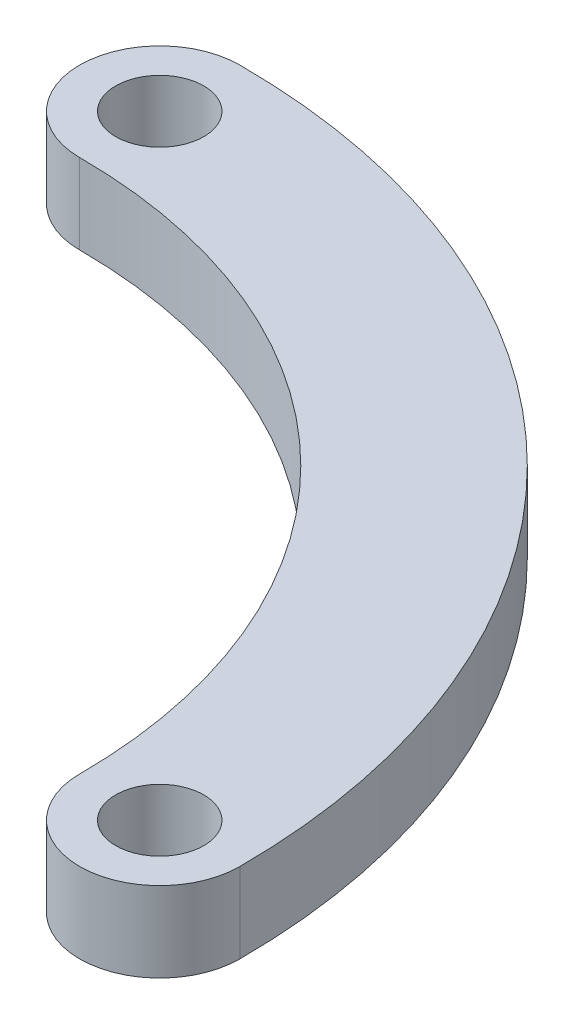
ISO-10303-21;
HEADER;
FILE_DESCRIPTION(('STEP AP214'),'2;1');
FILE_NAME('part.step','',(''),(''),'','','');
FILE_SCHEMA(('AUTOMOTIVE_DESIGN { 1 0 10303 214 1 1 1 1 }'));
ENDSEC;
DATA;
#1=APPLICATION_CONTEXT('core data for automotive mechanical design processes');
#2=APPLICATION_PROTOCOL_DEFINITION('international standard','automotive_design',2000,#1);
#3=PRODUCT_CONTEXT('',#1,'mechanical');
#4=PRODUCT('Part','Part','',(#3));
#5=PRODUCT_RELATED_PRODUCT_CATEGORY('part','',(#4));
#6=PRODUCT_DEFINITION_FORMATION('','',#4);
#7=PRODUCT_DEFINITION_CONTEXT('part definition',#1,'design');
#8=PRODUCT_DEFINITION('design','',#6,#7);
#9=PRODUCT_DEFINITION_SHAPE('','',#8);
#10=(LENGTH_UNIT() NAMED_UNIT(*) SI_UNIT(.MILLI.,.METRE.));
#11=(NAMED_UNIT(*) PLANE_ANGLE_UNIT() SI_UNIT($,.RADIAN.));
#12=(NAMED_UNIT(*) SI_UNIT($,.STERADIAN.) SOLID_ANGLE_UNIT());
#13=UNCERTAINTY_MEASURE_WITH_UNIT(LENGTH_MEASURE(1.E-05),#10,'distance_accuracy_value','');
#14=(GEOMETRIC_REPRESENTATION_CONTEXT(3) GLOBAL_UNCERTAINTY_ASSIGNED_CONTEXT((#13)) GLOBAL_UNIT_ASSIGNED_CONTEXT((#10,
#11,#12)) REPRESENTATION_CONTEXT('',''));
#15=CARTESIAN_POINT('',(0.,0.,0.));
#16=DIRECTION('',(0.,0.,1.));
#17=DIRECTION('',(1.,0.,0.));
#18=AXIS2_PLACEMENT_3D('',#15,#16,#17);
#19=CARTESIAN_POINT('',(0.,3.,-11.5));
#20=DIRECTION('',(0.,1.,0.));
#21=DIRECTION('',(0.,0.,1.));
#22=AXIS2_PLACEMENT_3D('',#19,#20,#21);
#23=PLANE('',#22);
#24=CARTESIAN_POINT('',(0.,3.,-23.));
#25=DIRECTION('',(0.,1.,0.));
#26=DIRECTION('',(0.,0.,1.));
#27=AXIS2_PLACEMENT_3D('',#24,#25,#26);
#28=CIRCLE('',#27,1.65);
#29=CARTESIAN_POINT('',(0.,3.,-21.35));
#30=VERTEX_POINT('',#29);
#31=EDGE_CURVE('E112',#30,#30,#28,.T.);
#32=ORIENTED_EDGE('',*,*,#31,.F.);
#33=EDGE_LOOP('',(#32));
#34=FACE_BOUND('',#33,.T.);
#35=CARTESIAN_POINT('',(0.,3.,-23.));
#36=DIRECTION('',(0.,1.,0.));
#37=DIRECTION('',(0.,0.,1.));
#38=AXIS2_PLACEMENT_3D('',#35,#36,#37);
#39=CIRCLE('',#38,3.);
#40=CARTESIAN_POINT('',(0.,3.,-26.));
#41=VERTEX_POINT('',#40);
#42=CARTESIAN_POINT('',(0.,3.,-20.));
#43=VERTEX_POINT('',#42);
#44=EDGE_CURVE('E92',#41,#43,#39,.T.);
#45=ORIENTED_EDGE('',*,*,#44,.T.);
#46=CARTESIAN_POINT('',(0.,3.,0.));
#47=DIRECTION('',(0.,-1.,0.));
#48=DIRECTION('',(0.,0.,1.));
#49=AXIS2_PLACEMENT_3D('',#46,#47,#48);
#50=CIRCLE('',#49,20.);
#51=CARTESIAN_POINT('',(20.,3.,0.));
#52=VERTEX_POINT('',#51);
#53=EDGE_CURVE('E87',#43,#52,#50,.T.);
#54=ORIENTED_EDGE('',*,*,#53,.T.);
#55=CARTESIAN_POINT('',(23.,3.,0.));
#56=DIRECTION('',(0.,1.,0.));
#57=DIRECTION('',(0.,0.,1.));
#58=AXIS2_PLACEMENT_3D('',#55,#56,#57);
#59=CIRCLE('',#58,3.);
#60=CARTESIAN_POINT('',(26.,3.,0.));
#61=VERTEX_POINT('',#60);
#62=EDGE_CURVE('E90',#52,#61,#59,.T.);
#63=ORIENTED_EDGE('',*,*,#62,.T.);
#64=CARTESIAN_POINT('',(0.,3.,0.));
#65=DIRECTION('',(0.,1.,0.));
#66=DIRECTION('',(0.,0.,1.));
#67=AXIS2_PLACEMENT_3D('',#64,#65,#66);
#68=CIRCLE('',#67,26.);
#69=EDGE_CURVE('E57',#61,#41,#68,.T.);
#70=ORIENTED_EDGE('',*,*,#69,.T.);
#71=EDGE_LOOP('',(#45,#54,#63,#70));
#72=FACE_BOUND('',#71,.T.);
#73=CARTESIAN_POINT('',(23.,3.,0.));
#74=DIRECTION('',(0.,1.,0.));
#75=DIRECTION('',(0.,0.,1.));
#76=AXIS2_PLACEMENT_3D('',#73,#74,#75);
#77=CIRCLE('',#76,1.65);
#78=CARTESIAN_POINT('',(23.,3.,1.65));
#79=VERTEX_POINT('',#78);
#80=EDGE_CURVE('E134',#79,#79,#77,.T.);
#81=ORIENTED_EDGE('',*,*,#80,.F.);
#82=EDGE_LOOP('',(#81));
#83=FACE_BOUND('',#82,.T.);
#84=ADVANCED_FACE('F39',(#34,#72,#83),#23,.T.);
#85=CARTESIAN_POINT('',(0.,0.,-11.5));
#86=DIRECTION('',(0.,1.,0.));
#87=DIRECTION('',(0.,0.,1.));
#88=AXIS2_PLACEMENT_3D('',#85,#86,#87);
#89=PLANE('',#88);
#90=CARTESIAN_POINT('',(0.,0.,-23.));
#91=DIRECTION('',(0.,1.,0.));
#92=DIRECTION('',(0.,0.,1.));
#93=AXIS2_PLACEMENT_3D('',#90,#91,#92);
#94=CIRCLE('',#93,3.);
#95=CARTESIAN_POINT('',(0.,0.,-26.));
#96=VERTEX_POINT('',#95);
#97=CARTESIAN_POINT('',(0.,0.,-20.));
#98=VERTEX_POINT('',#97);
#99=EDGE_CURVE('E108',#96,#98,#94,.T.);
#100=ORIENTED_EDGE('',*,*,#99,.F.);
#101=CARTESIAN_POINT('',(0.,0.,0.));
#102=DIRECTION('',(0.,1.,0.));
#103=DIRECTION('',(0.,0.,1.));
#104=AXIS2_PLACEMENT_3D('',#101,#102,#103);
#105=CIRCLE('',#104,26.);
#106=CARTESIAN_POINT('',(26.,0.,0.));
#107=VERTEX_POINT('',#106);
#108=EDGE_CURVE('E80',#107,#96,#105,.T.);
#109=ORIENTED_EDGE('',*,*,#108,.F.);
#110=CARTESIAN_POINT('',(23.,0.,0.));
#111=DIRECTION('',(0.,1.,0.));
#112=DIRECTION('',(0.,0.,1.));
#113=AXIS2_PLACEMENT_3D('',#110,#111,#112);
#114=CIRCLE('',#113,3.);
#115=CARTESIAN_POINT('',(20.,0.,0.));
#116=VERTEX_POINT('',#115);
#117=EDGE_CURVE('E74',#116,#107,#114,.T.);
#118=ORIENTED_EDGE('',*,*,#117,.F.);
#119=CARTESIAN_POINT('',(0.,0.,0.));
#120=DIRECTION('',(0.,-1.,0.));
#121=DIRECTION('',(0.,0.,1.));
#122=AXIS2_PLACEMENT_3D('',#119,#120,#121);
#123=CIRCLE('',#122,20.);
#124=EDGE_CURVE('E97',#98,#116,#123,.T.);
#125=ORIENTED_EDGE('',*,*,#124,.F.);
#126=EDGE_LOOP('',(#100,#109,#118,#125));
#127=FACE_BOUND('',#126,.T.);
#128=CARTESIAN_POINT('',(0.,0.,-23.));
#129=DIRECTION('',(0.,1.,0.));
#130=DIRECTION('',(0.,0.,1.));
#131=AXIS2_PLACEMENT_3D('',#128,#129,#130);
#132=CIRCLE('',#131,1.65);
#133=CARTESIAN_POINT('',(0.,0.,-21.35));
#134=VERTEX_POINT('',#133);
#135=EDGE_CURVE('E130',#134,#134,#132,.T.);
#136=ORIENTED_EDGE('',*,*,#135,.T.);
#137=EDGE_LOOP('',(#136));
#138=FACE_BOUND('',#137,.T.);
#139=CARTESIAN_POINT('',(23.,0.,0.));
#140=DIRECTION('',(0.,1.,0.));
#141=DIRECTION('',(0.,0.,1.));
#142=AXIS2_PLACEMENT_3D('',#139,#140,#141);
#143=CIRCLE('',#142,1.65);
#144=CARTESIAN_POINT('',(23.,0.,1.65));
#145=VERTEX_POINT('',#144);
#146=EDGE_CURVE('E138',#145,#145,#143,.T.);
#147=ORIENTED_EDGE('',*,*,#146,.T.);
#148=EDGE_LOOP('',(#147));
#149=FACE_BOUND('',#148,.T.);
#150=ADVANCED_FACE('F125',(#127,#138,#149),#89,.F.);
#151=CARTESIAN_POINT('',(0.,3.,-23.));
#152=DIRECTION('',(0.,-1.,0.));
#153=DIRECTION('',(0.,0.,-1.));
#154=AXIS2_PLACEMENT_3D('',#151,#152,#153);
#155=CYLINDRICAL_SURFACE('',#154,3.);
#156=ORIENTED_EDGE('',*,*,#99,.T.);
#157=DIRECTION('',(0.,-1.,0.));
#158=VECTOR('',#157,1.);
#159=CARTESIAN_POINT('',(0.,3.,-20.));
#160=LINE('',#159,#158);
#161=EDGE_CURVE('E11',#43,#98,#160,.T.);
#162=ORIENTED_EDGE('',*,*,#161,.F.);
#163=ORIENTED_EDGE('',*,*,#44,.F.);
#164=DIRECTION('',(0.,-1.,0.));
#165=VECTOR('',#164,1.);
#166=CARTESIAN_POINT('',(0.,3.,-26.));
#167=LINE('',#166,#165);
#168=EDGE_CURVE('E104',#41,#96,#167,.T.);
#169=ORIENTED_EDGE('',*,*,#168,.T.);
#170=EDGE_LOOP('',(#156,#162,#163,#169));
#171=FACE_BOUND('',#170,.T.);
#172=ADVANCED_FACE('F41',(#171),#155,.T.);
#173=CARTESIAN_POINT('',(0.,3.,0.));
#174=DIRECTION('',(0.,-1.,0.));
#175=DIRECTION('',(0.,0.,-1.));
#176=AXIS2_PLACEMENT_3D('',#173,#174,#175);
#177=CYLINDRICAL_SURFACE('',#176,20.);
#178=ORIENTED_EDGE('',*,*,#124,.T.);
#179=DIRECTION('',(0.,-1.,0.));
#180=VECTOR('',#179,1.);
#181=CARTESIAN_POINT('',(20.,3.,0.));
#182=LINE('',#181,#180);
#183=EDGE_CURVE('E49',#52,#116,#182,.T.);
#184=ORIENTED_EDGE('',*,*,#183,.F.);
#185=ORIENTED_EDGE('',*,*,#53,.F.);
#186=ORIENTED_EDGE('',*,*,#161,.T.);
#187=EDGE_LOOP('',(#178,#184,#185,#186));
#188=FACE_BOUND('',#187,.T.);
#189=ADVANCED_FACE('F96',(#188),#177,.F.);
#190=CARTESIAN_POINT('',(23.,3.,0.));
#191=DIRECTION('',(0.,-1.,0.));
#192=DIRECTION('',(0.,0.,-1.));
#193=AXIS2_PLACEMENT_3D('',#190,#191,#192);
#194=CYLINDRICAL_SURFACE('',#193,3.);
#195=ORIENTED_EDGE('',*,*,#117,.T.);
#196=DIRECTION('',(0.,-1.,0.));
#197=VECTOR('',#196,1.);
#198=CARTESIAN_POINT('',(26.,3.,0.));
#199=LINE('',#198,#197);
#200=EDGE_CURVE('E99',#61,#107,#199,.T.);
#201=ORIENTED_EDGE('',*,*,#200,.F.);
#202=ORIENTED_EDGE('',*,*,#62,.F.);
#203=ORIENTED_EDGE('',*,*,#183,.T.);
#204=EDGE_LOOP('',(#195,#201,#202,#203));
#205=FACE_BOUND('',#204,.T.);
#206=ADVANCED_FACE('F100',(#205),#194,.T.);
#207=CARTESIAN_POINT('',(0.,3.,0.));
#208=DIRECTION('',(0.,-1.,0.));
#209=DIRECTION('',(0.,0.,-1.));
#210=AXIS2_PLACEMENT_3D('',#207,#208,#209);
#211=CYLINDRICAL_SURFACE('',#210,26.);
#212=ORIENTED_EDGE('',*,*,#108,.T.);
#213=ORIENTED_EDGE('',*,*,#168,.F.);
#214=ORIENTED_EDGE('',*,*,#69,.F.);
#215=ORIENTED_EDGE('',*,*,#200,.T.);
#216=EDGE_LOOP('',(#212,#213,#214,#215));
#217=FACE_BOUND('',#216,.T.);
#218=ADVANCED_FACE('F122',(#217),#211,.T.);
#219=CARTESIAN_POINT('',(0.,3.,-23.));
#220=DIRECTION('',(0.,-1.,0.));
#221=DIRECTION('',(0.,0.,-1.));
#222=AXIS2_PLACEMENT_3D('',#219,#220,#221);
#223=CYLINDRICAL_SURFACE('',#222,1.65);
#224=ORIENTED_EDGE('',*,*,#31,.T.);
#225=EDGE_LOOP('',(#224));
#226=FACE_BOUND('',#225,.T.);
#227=ORIENTED_EDGE('',*,*,#135,.F.);
#228=EDGE_LOOP('',(#227));
#229=FACE_BOUND('',#228,.T.);
#230=ADVANCED_FACE('F157',(#226,#229),#223,.F.);
#231=CARTESIAN_POINT('',(23.,3.,0.));
#232=DIRECTION('',(0.,-1.,0.));
#233=DIRECTION('',(0.,0.,-1.));
#234=AXIS2_PLACEMENT_3D('',#231,#232,#233);
#235=CYLINDRICAL_SURFACE('',#234,1.65);
#236=ORIENTED_EDGE('',*,*,#80,.T.);
#237=EDGE_LOOP('',(#236));
#238=FACE_BOUND('',#237,.T.);
#239=ORIENTED_EDGE('',*,*,#146,.F.);
#240=EDGE_LOOP('',(#239));
#241=FACE_BOUND('',#240,.T.);
#242=ADVANCED_FACE('F146',(#238,#241),#235,.F.);
#243=CLOSED_SHELL('',(#84,#150,#172,#189,#206,#218,#230,#242));
#244=MANIFOLD_SOLID_BREP('B2',#243);
#245=ADVANCED_BREP_SHAPE_REPRESENTATION('',(#18,#244),#14);
#246=SHAPE_DEFINITION_REPRESENTATION(#9,#245);
ENDSEC;
END-ISO-10303-21;
